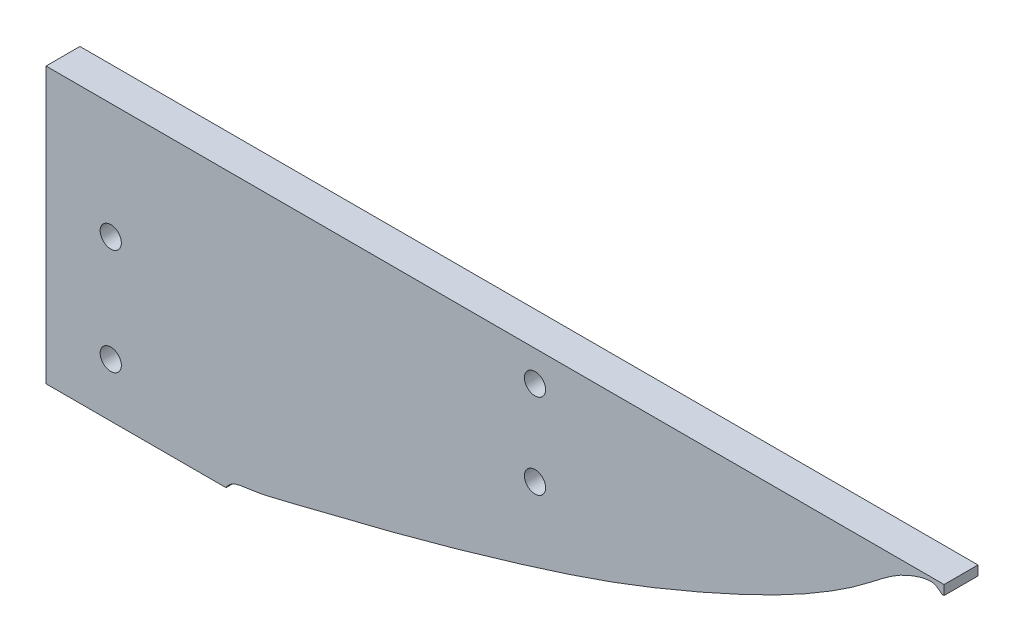
ISO-10303-21;
HEADER;
FILE_DESCRIPTION(('STEP AP214'),'2;1');
FILE_NAME('part.step','',(''),(''),'','','');
FILE_SCHEMA(('AUTOMOTIVE_DESIGN { 1 0 10303 214 1 1 1 1 }'));
ENDSEC;
DATA;
#1=APPLICATION_CONTEXT('core data for automotive mechanical design processes');
#2=APPLICATION_PROTOCOL_DEFINITION('international standard','automotive_design',2000,#1);
#3=PRODUCT_CONTEXT('',#1,'mechanical');
#4=PRODUCT('Part','Part','',(#3));
#5=PRODUCT_RELATED_PRODUCT_CATEGORY('part','',(#4));
#6=PRODUCT_DEFINITION_FORMATION('','',#4);
#7=PRODUCT_DEFINITION_CONTEXT('part definition',#1,'design');
#8=PRODUCT_DEFINITION('design','',#6,#7);
#9=PRODUCT_DEFINITION_SHAPE('','',#8);
#10=(LENGTH_UNIT() NAMED_UNIT(*) SI_UNIT(.MILLI.,.METRE.));
#11=(NAMED_UNIT(*) PLANE_ANGLE_UNIT() SI_UNIT($,.RADIAN.));
#12=(NAMED_UNIT(*) SI_UNIT($,.STERADIAN.) SOLID_ANGLE_UNIT());
#13=UNCERTAINTY_MEASURE_WITH_UNIT(LENGTH_MEASURE(1.E-05),#10,'distance_accuracy_value','');
#14=(GEOMETRIC_REPRESENTATION_CONTEXT(3) GLOBAL_UNCERTAINTY_ASSIGNED_CONTEXT((#13)) GLOBAL_UNIT_ASSIGNED_CONTEXT((#10,
#11,#12)) REPRESENTATION_CONTEXT('',''));
#15=CARTESIAN_POINT('',(0.,0.,0.));
#16=DIRECTION('',(0.,0.,1.));
#17=DIRECTION('',(1.,0.,0.));
#18=AXIS2_PLACEMENT_3D('',#15,#16,#17);
#19=CARTESIAN_POINT('',(-94.0449350170954,-62.656824564111,228.));
#20=DIRECTION('',(0.,0.,-1.));
#21=DIRECTION('',(-1.,0.,0.));
#22=AXIS2_PLACEMENT_3D('',#19,#20,#21);
#23=PLANE('',#22);
#24=CARTESIAN_POINT('',(-100.,-50.,228.));
#25=DIRECTION('',(0.,0.,-1.));
#26=DIRECTION('',(-1.,0.,0.));
#27=AXIS2_PLACEMENT_3D('',#24,#25,#26);
#28=CIRCLE('',#27,2.5);
#29=CARTESIAN_POINT('',(-102.5,-50.,228.));
#30=VERTEX_POINT('',#29);
#31=EDGE_CURVE('E207',#30,#30,#28,.F.);
#32=ORIENTED_EDGE('',*,*,#31,.F.);
#33=EDGE_LOOP('',(#32));
#34=FACE_BOUND('',#33,.T.);
#35=CARTESIAN_POINT('',(0.0705666698621599,-4.96037406111782,228.));
#36=DIRECTION('',(0.,0.,-1.));
#37=DIRECTION('',(-1.,0.,0.));
#38=AXIS2_PLACEMENT_3D('',#35,#36,#37);
#39=CIRCLE('',#38,2.5);
#40=CARTESIAN_POINT('',(-2.42943333013784,-4.96037406111782,228.));
#41=VERTEX_POINT('',#40);
#42=EDGE_CURVE('E203',#41,#41,#39,.F.);
#43=ORIENTED_EDGE('',*,*,#42,.F.);
#44=EDGE_LOOP('',(#43));
#45=FACE_BOUND('',#44,.T.);
#46=CARTESIAN_POINT('',(-72.8138292775494,-62.6476460664554,228.));
#47=CARTESIAN_POINT('',(-86.9678990777141,-62.6551055669489,228.));
#48=CARTESIAN_POINT('',(-101.121970515822,-62.659809078222,228.));
#49=CARTESIAN_POINT('',(-115.276042078606,-62.6622065109201,228.));
#50=B_SPLINE_CURVE_WITH_KNOTS('',3,(#46,#47,#48,#49),.UNSPECIFIED.,.F.,.F.,(4,4),(0.,1.),.UNSPECIFIED.);
#51=CARTESIAN_POINT('',(-115.276042078606,-62.6622065109201,228.));
#52=VERTEX_POINT('',#51);
#53=CARTESIAN_POINT('',(-72.8138292775494,-62.6476460664554,228.));
#54=VERTEX_POINT('',#53);
#55=EDGE_CURVE('E161',#52,#54,#50,.F.);
#56=ORIENTED_EDGE('',*,*,#55,.T.);
#57=CARTESIAN_POINT('',(95.9870795727235,0.,228.));
#58=CARTESIAN_POINT('',(95.9396036215973,0.112970505474959,228.));
#59=CARTESIAN_POINT('',(95.8579303670769,0.205342269269456,228.));
#60=CARTESIAN_POINT('',(95.6740200014432,0.364422958553267,228.));
#61=CARTESIAN_POINT('',(95.5751440351207,0.434492101100061,228.));
#62=CARTESIAN_POINT('',(95.2797180362278,0.646344348072362,228.));
#63=CARTESIAN_POINT('',(95.0871777384003,0.794286576688228,228.));
#64=CARTESIAN_POINT('',(94.7768780255614,0.984705681427013,228.));
#65=CARTESIAN_POINT('',(94.671513747439,1.04363294600287,228.));
#66=CARTESIAN_POINT('',(94.4535928153316,1.14455624627082,228.));
#67=CARTESIAN_POINT('',(94.3406654183511,1.18567953356444,228.));
#68=CARTESIAN_POINT('',(94.1073823704226,1.25043960987482,228.));
#69=CARTESIAN_POINT('',(93.986924979145,1.27409407200593,228.));
#70=CARTESIAN_POINT('',(93.7475325240829,1.306138985399,228.));
#71=CARTESIAN_POINT('',(93.6275436018803,1.31488585002167,228.));
#72=CARTESIAN_POINT('',(93.2669492660129,1.32552678194474,228.));
#73=CARTESIAN_POINT('',(93.0248882888412,1.31231421308436,228.));
#74=CARTESIAN_POINT('',(92.5438118686369,1.26378219102834,228.));
#75=CARTESIAN_POINT('',(92.3059003093066,1.22952957432613,228.));
#76=CARTESIAN_POINT('',(91.5987894124152,1.10158790815188,228.));
#77=CARTESIAN_POINT('',(91.1363844806001,0.982066322545524,228.));
#78=CARTESIAN_POINT('',(90.2199640456016,0.711126289948076,228.));
#79=CARTESIAN_POINT('',(89.7661271218269,0.559028878644449,228.));
#80=CARTESIAN_POINT('',(88.8663552607127,0.224790464625407,228.));
#81=CARTESIAN_POINT('',(88.4213569057542,0.043423723610443,228.));
#82=CARTESIAN_POINT('',(87.1116733654125,-0.534539987551747,228.));
#83=CARTESIAN_POINT('',(86.268105842587,-0.968133371146181,228.));
#84=CARTESIAN_POINT('',(83.8232832711083,-2.4092171403159,228.));
#85=CARTESIAN_POINT('',(82.3036656324402,-3.55007995738963,228.));
#86=CARTESIAN_POINT('',(80.044364990563,-5.2942540726603,228.));
#87=CARTESIAN_POINT('',(79.2940216254808,-5.88000311100967,228.));
#88=CARTESIAN_POINT('',(77.781688623662,-7.03347512957981,228.));
#89=CARTESIAN_POINT('',(77.0210553679462,-7.60333835990149,228.));
#90=CARTESIAN_POINT('',(74.7141962839172,-9.2745243606159,228.));
#91=CARTESIAN_POINT('',(73.1418739127763,-10.3356936463561,228.));
#92=CARTESIAN_POINT('',(69.9508267883373,-12.3866351231282,228.));
#93=CARTESIAN_POINT('',(68.3326277693247,-13.3772162360054,228.));
#94=CARTESIAN_POINT('',(65.0624023154828,-15.3063298578192,228.));
#95=CARTESIAN_POINT('',(63.4099573722207,-16.2442184281299,228.));
#96=CARTESIAN_POINT('',(60.0697582878732,-18.0656670187105,228.));
#97=CARTESIAN_POINT('',(58.3848769009774,-18.9487092848543,228.));
#98=CARTESIAN_POINT('',(53.2980752985602,-21.532497468782,228.));
#99=CARTESIAN_POINT('',(49.8636950163529,-23.1719321313768,228.));
#100=CARTESIAN_POINT('',(42.9518982520274,-26.3473643864309,228.));
#101=CARTESIAN_POINT('',(39.4722656668555,-27.8813904963574,228.));
#102=CARTESIAN_POINT('',(32.472735085506,-30.8583568421761,228.));
#103=CARTESIAN_POINT('',(28.9527451952238,-32.3028281861177,228.));
#104=CARTESIAN_POINT('',(21.8687438195763,-35.0762716955292,228.));
#105=CARTESIAN_POINT('',(18.3018847036567,-36.4016530085633,228.));
#106=CARTESIAN_POINT('',(11.1253545823098,-38.9198955737178,228.));
#107=CARTESIAN_POINT('',(7.51554380203982,-40.1147939434406,228.));
#108=CARTESIAN_POINT('',(0.269363888531351,-42.4254262446499,228.));
#109=CARTESIAN_POINT('',(-3.36664527588712,-43.5429762073017,228.));
#110=CARTESIAN_POINT('',(-10.6519424974999,-45.7297521851299,228.));
#111=CARTESIAN_POINT('',(-14.3012881897841,-46.8002541561035,228.));
#112=CARTESIAN_POINT('',(-21.6175611917676,-48.8811762231445,228.));
#113=CARTESIAN_POINT('',(-25.2849219976847,-49.8906808713797,228.));
#114=CARTESIAN_POINT('',(-36.3093462417465,-52.8332367290553,228.));
#115=CARTESIAN_POINT('',(-43.6895943349814,-54.6791792913748,228.));
#116=CARTESIAN_POINT('',(-52.9161366864018,-56.9790789525766,228.));
#117=CARTESIAN_POINT('',(-54.7619352745016,-57.4370678581288,228.));
#118=CARTESIAN_POINT('',(-57.532388194458,-58.1169216508708,228.));
#119=CARTESIAN_POINT('',(-58.4561678992463,-58.3423395732279,228.));
#120=CARTESIAN_POINT('',(-60.3042880671966,-58.7908974250758,228.));
#121=CARTESIAN_POINT('',(-61.2280994114436,-59.0164669045202,228.));
#122=CARTESIAN_POINT('',(-63.079297355708,-59.4510652340884,228.));
#123=CARTESIAN_POINT('',(-64.0073538284621,-59.6570622610554,228.));
#124=CARTESIAN_POINT('',(-65.4087449470293,-59.9232572743801,228.));
#125=CARTESIAN_POINT('',(-65.8773594543555,-60.0051494778518,228.));
#126=CARTESIAN_POINT('',(-66.8178709727226,-60.1539204407423,228.));
#127=CARTESIAN_POINT('',(-67.2902735104697,-60.2184885367757,228.));
#128=CARTESIAN_POINT('',(-68.2366723176885,-60.3403364696576,228.));
#129=CARTESIAN_POINT('',(-68.7099355051901,-60.4009687473963,228.));
#130=CARTESIAN_POINT('',(-69.4130861004259,-60.5227588514234,228.));
#131=CARTESIAN_POINT('',(-69.6463857518927,-60.5683122216158,228.));
#132=CARTESIAN_POINT('',(-70.1095475394248,-60.6751389874045,228.));
#133=CARTESIAN_POINT('',(-70.3393931671471,-60.7364878769376,228.));
#134=CARTESIAN_POINT('',(-70.792622261134,-60.8887376231701,228.));
#135=CARTESIAN_POINT('',(-71.0160661430338,-60.979362194469,228.));
#136=CARTESIAN_POINT('',(-71.3431016887533,-61.1524794413494,228.));
#137=CARTESIAN_POINT('',(-71.4518100613056,-61.2171950220773,228.));
#138=CARTESIAN_POINT('',(-71.6594473144561,-61.3586836626376,228.));
#139=CARTESIAN_POINT('',(-71.7583529462895,-61.4351048145036,228.));
#140=CARTESIAN_POINT('',(-72.0455840423709,-61.6753288529205,228.));
#141=CARTESIAN_POINT('',(-72.2212934636005,-61.8537092334965,228.));
#142=CARTESIAN_POINT('',(-72.4812153821046,-62.1254882826553,228.));
#143=CARTESIAN_POINT('',(-72.5668592290392,-62.2169509466378,228.));
#144=CARTESIAN_POINT('',(-72.6818181157841,-62.3657950955771,228.));
#145=CARTESIAN_POINT('',(-72.7175451499989,-62.4177630143983,228.));
#146=CARTESIAN_POINT('',(-72.7764684265662,-62.5276203665999,228.));
#147=CARTESIAN_POINT('',(-72.8001153141704,-62.5868842513674,228.));
#148=CARTESIAN_POINT('',(-72.8138292775494,-62.6476460664554,228.));
#149=B_SPLINE_CURVE_WITH_KNOTS('',3,(#57,#58,#59,#60,#61,#62,#63,#64,#65,#66,#67,#68,#69,#70,
#71,#72,#73,#74,#75,#76,#77,#78,#79,#80,#81,#82,#83,#84,#85,#86,#87,#88,#89,#90,#91,#92,#93,#94,
#95,#96,#97,#98,#99,#100,#101,#102,#103,#104,#105,#106,#107,#108,#109,#110,#111,#112,#113,#114,
#115,#116,#117,#118,#119,#120,#121,#122,#123,#124,#125,#126,#127,#128,#129,#130,#131,#132,#133,
#134,#135,#136,#137,#138,#139,#140,#141,#142,#143,#144,#145,#146,#147,#148),.UNSPECIFIED.,.F.,
.F.,(4,2,2,2,2,2,2,2,2,2,2,2,2,2,2,2,2,2,2,2,2,2,2,2,2,2,2,2,2,2,2,2,2,2,2,2,2,2,2,2,2,2,2,2,2,
4),(0.,0.00195312500000011,0.00390625000000011,0.00781250000000044,0.00976562500000067,
0.0117187500000008,0.013671875000001,0.0156250000000011,0.0195312500000012,0.0234375000000013,
0.0312500000000013,0.0390625000000013,0.0468750000000012,0.0625000000000012,0.0937500000000011,
0.109375000000001,0.125000000000001,0.156250000000001,0.187500000000001,0.218750000000001,
0.250000000000001,0.312500000000001,0.375000000000001,0.437500000000001,0.500000000000001,
0.562500000000001,0.625000000000001,0.687500000000001,0.750000000000001,0.875,0.906250000000001,
0.921875000000001,0.937500000000001,0.953125,0.9609375,0.96875,0.9765625,0.98046875,0.984375,
0.98828125,0.990234375,0.9921875,0.99609375,0.998046875,0.9990234375,1.),.UNSPECIFIED.);
#150=CARTESIAN_POINT('',(95.9870795727235,0.,228.));
#151=VERTEX_POINT('',#150);
#152=EDGE_CURVE('E88',#54,#151,#149,.F.);
#153=ORIENTED_EDGE('',*,*,#152,.T.);
#154=DIRECTION('',(1.,1.0259453337292E-13,0.));
#155=VECTOR('',#154,1.);
#156=CARTESIAN_POINT('',(95.9870795727235,0.,228.));
#157=LINE('',#156,#155);
#158=CARTESIAN_POINT('',(96.5604176839786,0.,228.));
#159=VERTEX_POINT('',#158);
#160=EDGE_CURVE('E102',#151,#159,#157,.T.);
#161=ORIENTED_EDGE('',*,*,#160,.T.);
#162=DIRECTION('',(0.,1.,0.));
#163=VECTOR('',#162,1.);
#164=CARTESIAN_POINT('',(96.5604176839786,2.25600000000004,228.));
#165=LINE('',#164,#163);
#166=CARTESIAN_POINT('',(96.5604176839786,2.25600000000004,228.));
#167=VERTEX_POINT('',#166);
#168=EDGE_CURVE('E96',#159,#167,#165,.T.);
#169=ORIENTED_EDGE('',*,*,#168,.T.);
#170=DIRECTION('',(-1.,0.,0.));
#171=VECTOR('',#170,1.);
#172=CARTESIAN_POINT('',(96.5604176839786,2.25600000000004,228.));
#173=LINE('',#172,#171);
#174=CARTESIAN_POINT('',(-115.276042078606,2.25600000000002,228.));
#175=VERTEX_POINT('',#174);
#176=EDGE_CURVE('E100',#167,#175,#173,.T.);
#177=ORIENTED_EDGE('',*,*,#176,.T.);
#178=DIRECTION('',(0.,-1.,0.));
#179=VECTOR('',#178,1.);
#180=CARTESIAN_POINT('',(-115.276042078606,-62.6622065109201,228.));
#181=LINE('',#180,#179);
#182=EDGE_CURVE('E51',#175,#52,#181,.T.);
#183=ORIENTED_EDGE('',*,*,#182,.T.);
#184=EDGE_LOOP('',(#56,#153,#161,#169,#177,#183));
#185=FACE_BOUND('',#184,.T.);
#186=CARTESIAN_POINT('',(0.0705666698621599,-25.,228.));
#187=DIRECTION('',(0.,0.,-1.));
#188=DIRECTION('',(-1.,0.,0.));
#189=AXIS2_PLACEMENT_3D('',#186,#187,#188);
#190=CIRCLE('',#189,2.5);
#191=CARTESIAN_POINT('',(-2.42943333013784,-25.,228.));
#192=VERTEX_POINT('',#191);
#193=EDGE_CURVE('E204',#192,#192,#190,.F.);
#194=ORIENTED_EDGE('',*,*,#193,.F.);
#195=EDGE_LOOP('',(#194));
#196=FACE_BOUND('',#195,.T.);
#197=CARTESIAN_POINT('',(-100.,-25.,228.));
#198=DIRECTION('',(0.,0.,-1.));
#199=DIRECTION('',(-1.,0.,0.));
#200=AXIS2_PLACEMENT_3D('',#197,#198,#199);
#201=CIRCLE('',#200,2.5);
#202=CARTESIAN_POINT('',(-102.5,-25.,228.));
#203=VERTEX_POINT('',#202);
#204=EDGE_CURVE('E210',#203,#203,#201,.F.);
#205=ORIENTED_EDGE('',*,*,#204,.F.);
#206=EDGE_LOOP('',(#205));
#207=FACE_BOUND('',#206,.T.);
#208=ADVANCED_FACE('F30',(#34,#45,#185,#196,#207),#23,.F.);
#209=CARTESIAN_POINT('',(-94.0449350170954,-62.656824564111,220.));
#210=DIRECTION('',(0.,0.,-1.));
#211=DIRECTION('',(-1.,0.,0.));
#212=AXIS2_PLACEMENT_3D('',#209,#210,#211);
#213=PLANE('',#212);
#214=CARTESIAN_POINT('',(-100.,-50.,220.));
#215=DIRECTION('',(0.,0.,-1.));
#216=DIRECTION('',(-1.,0.,0.));
#217=AXIS2_PLACEMENT_3D('',#214,#215,#216);
#218=CIRCLE('',#217,2.5);
#219=CARTESIAN_POINT('',(-102.5,-50.,220.));
#220=VERTEX_POINT('',#219);
#221=EDGE_CURVE('E208',#220,#220,#218,.F.);
#222=ORIENTED_EDGE('',*,*,#221,.T.);
#223=EDGE_LOOP('',(#222));
#224=FACE_BOUND('',#223,.T.);
#225=CARTESIAN_POINT('',(0.0705666698621599,-4.96037406111782,220.));
#226=DIRECTION('',(0.,0.,-1.));
#227=DIRECTION('',(-1.,0.,0.));
#228=AXIS2_PLACEMENT_3D('',#225,#226,#227);
#229=CIRCLE('',#228,2.5);
#230=CARTESIAN_POINT('',(-2.42943333013784,-4.96037406111782,220.));
#231=VERTEX_POINT('',#230);
#232=EDGE_CURVE('E200',#231,#231,#229,.F.);
#233=ORIENTED_EDGE('',*,*,#232,.T.);
#234=EDGE_LOOP('',(#233));
#235=FACE_BOUND('',#234,.T.);
#236=CARTESIAN_POINT('',(-115.276042078606,-62.6622065109201,220.));
#237=CARTESIAN_POINT('',(-101.121970515822,-62.659809078222,220.));
#238=CARTESIAN_POINT('',(-86.9678990777141,-62.6551055669489,220.));
#239=CARTESIAN_POINT('',(-72.8138292775494,-62.6476460664554,220.));
#240=B_SPLINE_CURVE_WITH_KNOTS('',3,(#236,#237,#238,#239),.UNSPECIFIED.,.F.,.F.,(4,4),(0.,1.),.UNSPECIFIED.);
#241=CARTESIAN_POINT('',(-115.276042078606,-62.6622065109201,220.));
#242=VERTEX_POINT('',#241);
#243=CARTESIAN_POINT('',(-72.8138292775494,-62.6476460664554,220.));
#244=VERTEX_POINT('',#243);
#245=EDGE_CURVE('E178',#242,#244,#240,.T.);
#246=ORIENTED_EDGE('',*,*,#245,.F.);
#247=DIRECTION('',(0.,-1.,0.));
#248=VECTOR('',#247,1.);
#249=CARTESIAN_POINT('',(-115.276042078606,-62.6622065109201,220.));
#250=LINE('',#249,#248);
#251=CARTESIAN_POINT('',(-115.276042078606,2.25600000000002,220.));
#252=VERTEX_POINT('',#251);
#253=EDGE_CURVE('E80',#252,#242,#250,.T.);
#254=ORIENTED_EDGE('',*,*,#253,.F.);
#255=DIRECTION('',(-1.,0.,0.));
#256=VECTOR('',#255,1.);
#257=CARTESIAN_POINT('',(96.5604176839786,2.25600000000004,220.));
#258=LINE('',#257,#256);
#259=CARTESIAN_POINT('',(96.5604176839786,2.25600000000004,220.));
#260=VERTEX_POINT('',#259);
#261=EDGE_CURVE('E74',#260,#252,#258,.T.);
#262=ORIENTED_EDGE('',*,*,#261,.F.);
#263=DIRECTION('',(0.,1.,0.));
#264=VECTOR('',#263,1.);
#265=CARTESIAN_POINT('',(96.5604176839786,2.25600000000004,220.));
#266=LINE('',#265,#264);
#267=CARTESIAN_POINT('',(96.5604176839786,0.,220.));
#268=VERTEX_POINT('',#267);
#269=EDGE_CURVE('E110',#268,#260,#266,.T.);
#270=ORIENTED_EDGE('',*,*,#269,.F.);
#271=DIRECTION('',(1.,1.0259453337292E-13,0.));
#272=VECTOR('',#271,1.);
#273=CARTESIAN_POINT('',(95.9870795727235,0.,220.));
#274=LINE('',#273,#272);
#275=CARTESIAN_POINT('',(95.9870795727235,0.,220.));
#276=VERTEX_POINT('',#275);
#277=EDGE_CURVE('E121',#276,#268,#274,.T.);
#278=ORIENTED_EDGE('',*,*,#277,.F.);
#279=CARTESIAN_POINT('',(-72.8138292775494,-62.6476460664554,220.));
#280=CARTESIAN_POINT('',(-72.8001153141704,-62.5868842513674,220.));
#281=CARTESIAN_POINT('',(-72.7764684265662,-62.5276203665999,220.));
#282=CARTESIAN_POINT('',(-72.7175451499989,-62.4177630143983,220.));
#283=CARTESIAN_POINT('',(-72.6818181157841,-62.3657950955771,220.));
#284=CARTESIAN_POINT('',(-72.5668592290392,-62.2169509466378,220.));
#285=CARTESIAN_POINT('',(-72.4812153821046,-62.1254882826553,220.));
#286=CARTESIAN_POINT('',(-72.2212934636005,-61.8537092334965,220.));
#287=CARTESIAN_POINT('',(-72.0455840423709,-61.6753288529205,220.));
#288=CARTESIAN_POINT('',(-71.7583529462895,-61.4351048145036,220.));
#289=CARTESIAN_POINT('',(-71.6594473144561,-61.3586836626376,220.));
#290=CARTESIAN_POINT('',(-71.4518100613056,-61.2171950220773,220.));
#291=CARTESIAN_POINT('',(-71.3431016887533,-61.1524794413494,220.));
#292=CARTESIAN_POINT('',(-71.0160661430338,-60.979362194469,220.));
#293=CARTESIAN_POINT('',(-70.792622261134,-60.8887376231701,220.));
#294=CARTESIAN_POINT('',(-70.3393931671471,-60.7364878769376,220.));
#295=CARTESIAN_POINT('',(-70.1095475394248,-60.6751389874045,220.));
#296=CARTESIAN_POINT('',(-69.6463857518927,-60.5683122216158,220.));
#297=CARTESIAN_POINT('',(-69.4130861004259,-60.5227588514234,220.));
#298=CARTESIAN_POINT('',(-68.7099355051901,-60.4009687473963,220.));
#299=CARTESIAN_POINT('',(-68.2366723176885,-60.3403364696576,220.));
#300=CARTESIAN_POINT('',(-67.2902735104697,-60.2184885367757,220.));
#301=CARTESIAN_POINT('',(-66.8178709727226,-60.1539204407423,220.));
#302=CARTESIAN_POINT('',(-65.8773594543555,-60.0051494778518,220.));
#303=CARTESIAN_POINT('',(-65.4087449470293,-59.9232572743801,220.));
#304=CARTESIAN_POINT('',(-64.0073538284621,-59.6570622610554,220.));
#305=CARTESIAN_POINT('',(-63.079297355708,-59.4510652340884,220.));
#306=CARTESIAN_POINT('',(-61.2280994114436,-59.0164669045202,220.));
#307=CARTESIAN_POINT('',(-60.3042880671966,-58.7908974250758,220.));
#308=CARTESIAN_POINT('',(-58.4561678992463,-58.3423395732279,220.));
#309=CARTESIAN_POINT('',(-57.532388194458,-58.1169216508708,220.));
#310=CARTESIAN_POINT('',(-54.7619352745016,-57.4370678581288,220.));
#311=CARTESIAN_POINT('',(-52.9161366864018,-56.9790789525766,220.));
#312=CARTESIAN_POINT('',(-43.6895943349814,-54.6791792913748,220.));
#313=CARTESIAN_POINT('',(-36.3093462417465,-52.8332367290553,220.));
#314=CARTESIAN_POINT('',(-25.2849219976847,-49.8906808713797,220.));
#315=CARTESIAN_POINT('',(-21.6175611917676,-48.8811762231445,220.));
#316=CARTESIAN_POINT('',(-14.3012881897841,-46.8002541561035,220.));
#317=CARTESIAN_POINT('',(-10.6519424974999,-45.7297521851299,220.));
#318=CARTESIAN_POINT('',(-3.36664527588712,-43.5429762073017,220.));
#319=CARTESIAN_POINT('',(0.269363888531351,-42.4254262446499,220.));
#320=CARTESIAN_POINT('',(7.51554380203982,-40.1147939434406,220.));
#321=CARTESIAN_POINT('',(11.1253545823098,-38.9198955737178,220.));
#322=CARTESIAN_POINT('',(18.3018847036567,-36.4016530085633,220.));
#323=CARTESIAN_POINT('',(21.8687438195763,-35.0762716955292,220.));
#324=CARTESIAN_POINT('',(28.9527451952238,-32.3028281861177,220.));
#325=CARTESIAN_POINT('',(32.472735085506,-30.8583568421761,220.));
#326=CARTESIAN_POINT('',(39.4722656668555,-27.8813904963574,220.));
#327=CARTESIAN_POINT('',(42.9518982520274,-26.3473643864309,220.));
#328=CARTESIAN_POINT('',(49.8636950163529,-23.1719321313768,220.));
#329=CARTESIAN_POINT('',(53.2980752985602,-21.532497468782,220.));
#330=CARTESIAN_POINT('',(58.3848769009774,-18.9487092848543,220.));
#331=CARTESIAN_POINT('',(60.0697582878732,-18.0656670187105,220.));
#332=CARTESIAN_POINT('',(63.4099573722207,-16.2442184281299,220.));
#333=CARTESIAN_POINT('',(65.0624023154828,-15.3063298578192,220.));
#334=CARTESIAN_POINT('',(68.3326277693247,-13.3772162360054,220.));
#335=CARTESIAN_POINT('',(69.9508267883373,-12.3866351231282,220.));
#336=CARTESIAN_POINT('',(73.1418739127763,-10.3356936463561,220.));
#337=CARTESIAN_POINT('',(74.7141962839172,-9.2745243606159,220.));
#338=CARTESIAN_POINT('',(77.0210553679462,-7.60333835990149,220.));
#339=CARTESIAN_POINT('',(77.781688623662,-7.03347512957981,220.));
#340=CARTESIAN_POINT('',(79.2940216254808,-5.88000311100967,220.));
#341=CARTESIAN_POINT('',(80.044364990563,-5.2942540726603,220.));
#342=CARTESIAN_POINT('',(82.3036656324402,-3.55007995738963,220.));
#343=CARTESIAN_POINT('',(83.8232832711083,-2.4092171403159,220.));
#344=CARTESIAN_POINT('',(86.268105842587,-0.968133371146181,220.));
#345=CARTESIAN_POINT('',(87.1116733654125,-0.534539987551747,220.));
#346=CARTESIAN_POINT('',(88.4213569057542,0.043423723610443,220.));
#347=CARTESIAN_POINT('',(88.8663552607127,0.224790464625407,220.));
#348=CARTESIAN_POINT('',(89.7661271218269,0.559028878644449,220.));
#349=CARTESIAN_POINT('',(90.2199640456016,0.711126289948076,220.));
#350=CARTESIAN_POINT('',(91.1363844806001,0.982066322545524,220.));
#351=CARTESIAN_POINT('',(91.5987894124152,1.10158790815188,220.));
#352=CARTESIAN_POINT('',(92.3059003093066,1.22952957432613,220.));
#353=CARTESIAN_POINT('',(92.5438118686369,1.26378219102834,220.));
#354=CARTESIAN_POINT('',(93.0248882888412,1.31231421308436,220.));
#355=CARTESIAN_POINT('',(93.2669492660129,1.32552678194474,220.));
#356=CARTESIAN_POINT('',(93.6275436018803,1.31488585002167,220.));
#357=CARTESIAN_POINT('',(93.7475325240829,1.306138985399,220.));
#358=CARTESIAN_POINT('',(93.986924979145,1.27409407200593,220.));
#359=CARTESIAN_POINT('',(94.1073823704226,1.25043960987482,220.));
#360=CARTESIAN_POINT('',(94.3406654183511,1.18567953356444,220.));
#361=CARTESIAN_POINT('',(94.4535928153316,1.14455624627082,220.));
#362=CARTESIAN_POINT('',(94.671513747439,1.04363294600287,220.));
#363=CARTESIAN_POINT('',(94.7768780255614,0.984705681427013,220.));
#364=CARTESIAN_POINT('',(95.0871777384003,0.794286576688228,220.));
#365=CARTESIAN_POINT('',(95.2797180362278,0.646344348072362,220.));
#366=CARTESIAN_POINT('',(95.5751440351207,0.434492101100061,220.));
#367=CARTESIAN_POINT('',(95.6740200014432,0.364422958553267,220.));
#368=CARTESIAN_POINT('',(95.8579303670769,0.205342269269456,220.));
#369=CARTESIAN_POINT('',(95.9396036215973,0.112970505474959,220.));
#370=CARTESIAN_POINT('',(95.9870795727235,0.,220.));
#371=B_SPLINE_CURVE_WITH_KNOTS('',3,(#279,#280,#281,#282,#283,#284,#285,#286,#287,#288,#289,
#290,#291,#292,#293,#294,#295,#296,#297,#298,#299,#300,#301,#302,#303,#304,#305,#306,#307,#308,
#309,#310,#311,#312,#313,#314,#315,#316,#317,#318,#319,#320,#321,#322,#323,#324,#325,#326,#327,
#328,#329,#330,#331,#332,#333,#334,#335,#336,#337,#338,#339,#340,#341,#342,#343,#344,#345,#346,
#347,#348,#349,#350,#351,#352,#353,#354,#355,#356,#357,#358,#359,#360,#361,#362,#363,#364,#365,
#366,#367,#368,#369,#370),.UNSPECIFIED.,.F.,.F.,(4,2,2,2,2,2,2,2,2,2,2,2,2,2,2,2,2,2,2,2,2,2,2,
2,2,2,2,2,2,2,2,2,2,2,2,2,2,2,2,2,2,2,2,2,2,4),(0.,0.000976562499999889,0.00195312499999989,
0.00390624999999989,0.0078125,0.00976562499999989,0.0117187499999999,0.0156249999999998,
0.0195312499999998,0.0234374999999997,0.0312499999999996,0.0390624999999996,0.0468749999999996,
0.0624999999999994,0.0781249999999994,0.0937499999999994,0.125,0.249999999999999,
0.312499999999999,0.374999999999999,0.437499999999999,0.499999999999999,0.562499999999999,
0.624999999999999,0.687499999999999,0.749999999999999,0.781249999999999,0.812499999999999,
0.843749999999999,0.874999999999999,0.890624999999999,0.906249999999999,0.937499999999999,
0.953124999999999,0.960937499999999,0.968749999999999,0.976562499999999,0.980468749999999,
0.984374999999999,0.986328124999999,0.988281249999999,0.990234374999999,0.9921875,0.99609375,
0.998046875,1.),.UNSPECIFIED.);
#372=EDGE_CURVE('E258',#244,#276,#371,.T.);
#373=ORIENTED_EDGE('',*,*,#372,.F.);
#374=EDGE_LOOP('',(#246,#254,#262,#270,#278,#373));
#375=FACE_BOUND('',#374,.T.);
#376=CARTESIAN_POINT('',(0.0705666698621599,-25.,220.));
#377=DIRECTION('',(0.,0.,-1.));
#378=DIRECTION('',(-1.,0.,0.));
#379=AXIS2_PLACEMENT_3D('',#376,#377,#378);
#380=CIRCLE('',#379,2.5);
#381=CARTESIAN_POINT('',(-2.42943333013784,-25.,220.));
#382=VERTEX_POINT('',#381);
#383=EDGE_CURVE('E205',#382,#382,#380,.F.);
#384=ORIENTED_EDGE('',*,*,#383,.T.);
#385=EDGE_LOOP('',(#384));
#386=FACE_BOUND('',#385,.T.);
#387=CARTESIAN_POINT('',(-100.,-25.,220.));
#388=DIRECTION('',(0.,0.,-1.));
#389=DIRECTION('',(-1.,0.,0.));
#390=AXIS2_PLACEMENT_3D('',#387,#388,#389);
#391=CIRCLE('',#390,2.5);
#392=CARTESIAN_POINT('',(-102.5,-25.,220.));
#393=VERTEX_POINT('',#392);
#394=EDGE_CURVE('E36',#393,#393,#391,.F.);
#395=ORIENTED_EDGE('',*,*,#394,.T.);
#396=EDGE_LOOP('',(#395));
#397=FACE_BOUND('',#396,.T.);
#398=ADVANCED_FACE('F139',(#224,#235,#375,#386,#397),#213,.T.);
#399=CARTESIAN_POINT('',(-115.276042078606,-62.6622065109201,228.));
#400=CARTESIAN_POINT('',(-101.121970515822,-62.659809078222,228.));
#401=CARTESIAN_POINT('',(-86.9678990777141,-62.6551055669489,228.));
#402=CARTESIAN_POINT('',(-72.8138292775494,-62.6476460664554,228.));
#403=B_SPLINE_CURVE_WITH_KNOTS('',3,(#399,#400,#401,#402),.UNSPECIFIED.,.F.,.F.,(4,4),(0.,1.),.UNSPECIFIED.);
#404=DIRECTION('',(0.,0.,-1.));
#405=VECTOR('',#404,1.);
#406=SURFACE_OF_LINEAR_EXTRUSION('',#403,#405);
#407=ORIENTED_EDGE('',*,*,#245,.T.);
#408=DIRECTION('',(0.,0.,-1.));
#409=VECTOR('',#408,1.);
#410=CARTESIAN_POINT('',(-72.8138292775494,-62.6476460664554,228.));
#411=LINE('',#410,#409);
#412=EDGE_CURVE('E11',#54,#244,#411,.T.);
#413=ORIENTED_EDGE('',*,*,#412,.F.);
#414=ORIENTED_EDGE('',*,*,#55,.F.);
#415=DIRECTION('',(0.,0.,-1.));
#416=VECTOR('',#415,1.);
#417=CARTESIAN_POINT('',(-115.276042078606,-62.6622065109201,228.));
#418=LINE('',#417,#416);
#419=EDGE_CURVE('E116',#52,#242,#418,.T.);
#420=ORIENTED_EDGE('',*,*,#419,.T.);
#421=EDGE_LOOP('',(#407,#413,#414,#420));
#422=FACE_BOUND('',#421,.T.);
#423=ADVANCED_FACE('F32',(#422),#406,.F.);
#424=CARTESIAN_POINT('',(-72.8138292775494,-62.6476460664554,228.));
#425=CARTESIAN_POINT('',(-72.8001153141704,-62.5868842513674,228.));
#426=CARTESIAN_POINT('',(-72.7764684265662,-62.5276203665999,228.));
#427=CARTESIAN_POINT('',(-72.7175451499989,-62.4177630143983,228.));
#428=CARTESIAN_POINT('',(-72.6818181157841,-62.3657950955771,228.));
#429=CARTESIAN_POINT('',(-72.5668592290392,-62.2169509466378,228.));
#430=CARTESIAN_POINT('',(-72.4812153821046,-62.1254882826553,228.));
#431=CARTESIAN_POINT('',(-72.2212934636005,-61.8537092334965,228.));
#432=CARTESIAN_POINT('',(-72.0455840423709,-61.6753288529205,228.));
#433=CARTESIAN_POINT('',(-71.7583529462895,-61.4351048145036,228.));
#434=CARTESIAN_POINT('',(-71.6594473144561,-61.3586836626376,228.));
#435=CARTESIAN_POINT('',(-71.4518100613056,-61.2171950220773,228.));
#436=CARTESIAN_POINT('',(-71.3431016887533,-61.1524794413494,228.));
#437=CARTESIAN_POINT('',(-71.0160661430338,-60.979362194469,228.));
#438=CARTESIAN_POINT('',(-70.792622261134,-60.8887376231701,228.));
#439=CARTESIAN_POINT('',(-70.3393931671471,-60.7364878769376,228.));
#440=CARTESIAN_POINT('',(-70.1095475394248,-60.6751389874045,228.));
#441=CARTESIAN_POINT('',(-69.6463857518927,-60.5683122216158,228.));
#442=CARTESIAN_POINT('',(-69.4130861004259,-60.5227588514234,228.));
#443=CARTESIAN_POINT('',(-68.7099355051901,-60.4009687473963,228.));
#444=CARTESIAN_POINT('',(-68.2366723176885,-60.3403364696576,228.));
#445=CARTESIAN_POINT('',(-67.2902735104697,-60.2184885367757,228.));
#446=CARTESIAN_POINT('',(-66.8178709727226,-60.1539204407423,228.));
#447=CARTESIAN_POINT('',(-65.8773594543555,-60.0051494778518,228.));
#448=CARTESIAN_POINT('',(-65.4087449470293,-59.9232572743801,228.));
#449=CARTESIAN_POINT('',(-64.0073538284621,-59.6570622610554,228.));
#450=CARTESIAN_POINT('',(-63.079297355708,-59.4510652340884,228.));
#451=CARTESIAN_POINT('',(-61.2280994114436,-59.0164669045202,228.));
#452=CARTESIAN_POINT('',(-60.3042880671966,-58.7908974250758,228.));
#453=CARTESIAN_POINT('',(-58.4561678992463,-58.3423395732279,228.));
#454=CARTESIAN_POINT('',(-57.532388194458,-58.1169216508708,228.));
#455=CARTESIAN_POINT('',(-54.7619352745016,-57.4370678581288,228.));
#456=CARTESIAN_POINT('',(-52.9161366864018,-56.9790789525766,228.));
#457=CARTESIAN_POINT('',(-43.6895943349814,-54.6791792913748,228.));
#458=CARTESIAN_POINT('',(-36.3093462417465,-52.8332367290553,228.));
#459=CARTESIAN_POINT('',(-25.2849219976847,-49.8906808713797,228.));
#460=CARTESIAN_POINT('',(-21.6175611917676,-48.8811762231445,228.));
#461=CARTESIAN_POINT('',(-14.3012881897841,-46.8002541561035,228.));
#462=CARTESIAN_POINT('',(-10.6519424974999,-45.7297521851299,228.));
#463=CARTESIAN_POINT('',(-3.36664527588712,-43.5429762073017,228.));
#464=CARTESIAN_POINT('',(0.269363888531351,-42.4254262446499,228.));
#465=CARTESIAN_POINT('',(7.51554380203982,-40.1147939434406,228.));
#466=CARTESIAN_POINT('',(11.1253545823098,-38.9198955737178,228.));
#467=CARTESIAN_POINT('',(18.3018847036567,-36.4016530085633,228.));
#468=CARTESIAN_POINT('',(21.8687438195763,-35.0762716955292,228.));
#469=CARTESIAN_POINT('',(28.9527451952238,-32.3028281861177,228.));
#470=CARTESIAN_POINT('',(32.472735085506,-30.8583568421761,228.));
#471=CARTESIAN_POINT('',(39.4722656668555,-27.8813904963574,228.));
#472=CARTESIAN_POINT('',(42.9518982520274,-26.3473643864309,228.));
#473=CARTESIAN_POINT('',(49.8636950163529,-23.1719321313768,228.));
#474=CARTESIAN_POINT('',(53.2980752985602,-21.532497468782,228.));
#475=CARTESIAN_POINT('',(58.3848769009774,-18.9487092848543,228.));
#476=CARTESIAN_POINT('',(60.0697582878732,-18.0656670187105,228.));
#477=CARTESIAN_POINT('',(63.4099573722207,-16.2442184281299,228.));
#478=CARTESIAN_POINT('',(65.0624023154828,-15.3063298578192,228.));
#479=CARTESIAN_POINT('',(68.3326277693247,-13.3772162360054,228.));
#480=CARTESIAN_POINT('',(69.9508267883373,-12.3866351231282,228.));
#481=CARTESIAN_POINT('',(73.1418739127763,-10.3356936463561,228.));
#482=CARTESIAN_POINT('',(74.7141962839172,-9.2745243606159,228.));
#483=CARTESIAN_POINT('',(77.0210553679462,-7.60333835990149,228.));
#484=CARTESIAN_POINT('',(77.781688623662,-7.03347512957981,228.));
#485=CARTESIAN_POINT('',(79.2940216254808,-5.88000311100967,228.));
#486=CARTESIAN_POINT('',(80.044364990563,-5.2942540726603,228.));
#487=CARTESIAN_POINT('',(82.3036656324402,-3.55007995738963,228.));
#488=CARTESIAN_POINT('',(83.8232832711083,-2.4092171403159,228.));
#489=CARTESIAN_POINT('',(86.268105842587,-0.968133371146181,228.));
#490=CARTESIAN_POINT('',(87.1116733654125,-0.534539987551747,228.));
#491=CARTESIAN_POINT('',(88.4213569057542,0.043423723610443,228.));
#492=CARTESIAN_POINT('',(88.8663552607127,0.224790464625407,228.));
#493=CARTESIAN_POINT('',(89.7661271218269,0.559028878644449,228.));
#494=CARTESIAN_POINT('',(90.2199640456016,0.711126289948076,228.));
#495=CARTESIAN_POINT('',(91.1363844806001,0.982066322545524,228.));
#496=CARTESIAN_POINT('',(91.5987894124152,1.10158790815188,228.));
#497=CARTESIAN_POINT('',(92.3059003093066,1.22952957432613,228.));
#498=CARTESIAN_POINT('',(92.5438118686369,1.26378219102834,228.));
#499=CARTESIAN_POINT('',(93.0248882888412,1.31231421308436,228.));
#500=CARTESIAN_POINT('',(93.2669492660129,1.32552678194474,228.));
#501=CARTESIAN_POINT('',(93.6275436018803,1.31488585002167,228.));
#502=CARTESIAN_POINT('',(93.7475325240829,1.306138985399,228.));
#503=CARTESIAN_POINT('',(93.986924979145,1.27409407200593,228.));
#504=CARTESIAN_POINT('',(94.1073823704226,1.25043960987482,228.));
#505=CARTESIAN_POINT('',(94.3406654183511,1.18567953356444,228.));
#506=CARTESIAN_POINT('',(94.4535928153316,1.14455624627082,228.));
#507=CARTESIAN_POINT('',(94.671513747439,1.04363294600287,228.));
#508=CARTESIAN_POINT('',(94.7768780255614,0.984705681427013,228.));
#509=CARTESIAN_POINT('',(95.0871777384003,0.794286576688228,228.));
#510=CARTESIAN_POINT('',(95.2797180362278,0.646344348072362,228.));
#511=CARTESIAN_POINT('',(95.5751440351207,0.434492101100061,228.));
#512=CARTESIAN_POINT('',(95.6740200014432,0.364422958553267,228.));
#513=CARTESIAN_POINT('',(95.8579303670769,0.205342269269456,228.));
#514=CARTESIAN_POINT('',(95.9396036215973,0.112970505474959,228.));
#515=CARTESIAN_POINT('',(95.9870795727235,0.,228.));
#516=B_SPLINE_CURVE_WITH_KNOTS('',3,(#424,#425,#426,#427,#428,#429,#430,#431,#432,#433,#434,
#435,#436,#437,#438,#439,#440,#441,#442,#443,#444,#445,#446,#447,#448,#449,#450,#451,#452,#453,
#454,#455,#456,#457,#458,#459,#460,#461,#462,#463,#464,#465,#466,#467,#468,#469,#470,#471,#472,
#473,#474,#475,#476,#477,#478,#479,#480,#481,#482,#483,#484,#485,#486,#487,#488,#489,#490,#491,
#492,#493,#494,#495,#496,#497,#498,#499,#500,#501,#502,#503,#504,#505,#506,#507,#508,#509,#510,
#511,#512,#513,#514,#515),.UNSPECIFIED.,.F.,.F.,(4,2,2,2,2,2,2,2,2,2,2,2,2,2,2,2,2,2,2,2,2,2,2,
2,2,2,2,2,2,2,2,2,2,2,2,2,2,2,2,2,2,2,2,2,2,4),(0.,0.000976562499999889,0.00195312499999989,
0.00390624999999989,0.0078125,0.00976562499999989,0.0117187499999999,0.0156249999999998,
0.0195312499999998,0.0234374999999997,0.0312499999999996,0.0390624999999996,0.0468749999999996,
0.0624999999999994,0.0781249999999994,0.0937499999999994,0.125,0.249999999999999,
0.312499999999999,0.374999999999999,0.437499999999999,0.499999999999999,0.562499999999999,
0.624999999999999,0.687499999999999,0.749999999999999,0.781249999999999,0.812499999999999,
0.843749999999999,0.874999999999999,0.890624999999999,0.906249999999999,0.937499999999999,
0.953124999999999,0.960937499999999,0.968749999999999,0.976562499999999,0.980468749999999,
0.984374999999999,0.986328124999999,0.988281249999999,0.990234374999999,0.9921875,0.99609375,
0.998046875,1.),.UNSPECIFIED.);
#517=DIRECTION('',(0.,0.,-1.));
#518=VECTOR('',#517,1.);
#519=SURFACE_OF_LINEAR_EXTRUSION('',#516,#518);
#520=ORIENTED_EDGE('',*,*,#372,.T.);
#521=DIRECTION('',(0.,0.,-1.));
#522=VECTOR('',#521,1.);
#523=CARTESIAN_POINT('',(95.9870795727235,0.,228.));
#524=LINE('',#523,#522);
#525=EDGE_CURVE('E42',#151,#276,#524,.T.);
#526=ORIENTED_EDGE('',*,*,#525,.F.);
#527=ORIENTED_EDGE('',*,*,#152,.F.);
#528=ORIENTED_EDGE('',*,*,#412,.T.);
#529=EDGE_LOOP('',(#520,#526,#527,#528));
#530=FACE_BOUND('',#529,.T.);
#531=ADVANCED_FACE('F236',(#530),#519,.F.);
#532=CARTESIAN_POINT('',(95.9870795727235,0.,228.));
#533=DIRECTION('',(-1.0259453337292E-13,1.,0.));
#534=DIRECTION('',(-1.,-1.0259453337292E-13,0.));
#535=AXIS2_PLACEMENT_3D('',#532,#533,#534);
#536=PLANE('',#535);
#537=ORIENTED_EDGE('',*,*,#277,.T.);
#538=DIRECTION('',(0.,0.,-1.));
#539=VECTOR('',#538,1.);
#540=CARTESIAN_POINT('',(96.5604176839786,0.,228.));
#541=LINE('',#540,#539);
#542=EDGE_CURVE('E111',#159,#268,#541,.T.);
#543=ORIENTED_EDGE('',*,*,#542,.F.);
#544=ORIENTED_EDGE('',*,*,#160,.F.);
#545=ORIENTED_EDGE('',*,*,#525,.T.);
#546=EDGE_LOOP('',(#537,#543,#544,#545));
#547=FACE_BOUND('',#546,.T.);
#548=ADVANCED_FACE('F240',(#547),#536,.F.);
#549=CARTESIAN_POINT('',(96.5604176839786,2.25600000000004,228.));
#550=DIRECTION('',(-1.,0.,0.));
#551=DIRECTION('',(0.,0.,1.));
#552=AXIS2_PLACEMENT_3D('',#549,#550,#551);
#553=PLANE('',#552);
#554=ORIENTED_EDGE('',*,*,#269,.T.);
#555=DIRECTION('',(0.,0.,-1.));
#556=VECTOR('',#555,1.);
#557=CARTESIAN_POINT('',(96.5604176839786,2.25600000000004,228.));
#558=LINE('',#557,#556);
#559=EDGE_CURVE('E107',#167,#260,#558,.T.);
#560=ORIENTED_EDGE('',*,*,#559,.F.);
#561=ORIENTED_EDGE('',*,*,#168,.F.);
#562=ORIENTED_EDGE('',*,*,#542,.T.);
#563=EDGE_LOOP('',(#554,#560,#561,#562));
#564=FACE_BOUND('',#563,.T.);
#565=ADVANCED_FACE('F108',(#564),#553,.F.);
#566=CARTESIAN_POINT('',(96.5604176839786,2.25600000000004,228.));
#567=DIRECTION('',(0.,-1.,0.));
#568=DIRECTION('',(1.,0.,0.));
#569=AXIS2_PLACEMENT_3D('',#566,#567,#568);
#570=PLANE('',#569);
#571=ORIENTED_EDGE('',*,*,#261,.T.);
#572=DIRECTION('',(0.,0.,-1.));
#573=VECTOR('',#572,1.);
#574=CARTESIAN_POINT('',(-115.276042078606,2.25600000000002,228.));
#575=LINE('',#574,#573);
#576=EDGE_CURVE('E112',#175,#252,#575,.T.);
#577=ORIENTED_EDGE('',*,*,#576,.F.);
#578=ORIENTED_EDGE('',*,*,#176,.F.);
#579=ORIENTED_EDGE('',*,*,#559,.T.);
#580=EDGE_LOOP('',(#571,#577,#578,#579));
#581=FACE_BOUND('',#580,.T.);
#582=ADVANCED_FACE('F114',(#581),#570,.F.);
#583=CARTESIAN_POINT('',(-115.276042078606,-62.6622065109201,228.));
#584=DIRECTION('',(1.,0.,0.));
#585=DIRECTION('',(0.,0.,-1.));
#586=AXIS2_PLACEMENT_3D('',#583,#584,#585);
#587=PLANE('',#586);
#588=ORIENTED_EDGE('',*,*,#253,.T.);
#589=ORIENTED_EDGE('',*,*,#419,.F.);
#590=ORIENTED_EDGE('',*,*,#182,.F.);
#591=ORIENTED_EDGE('',*,*,#576,.T.);
#592=EDGE_LOOP('',(#588,#589,#590,#591));
#593=FACE_BOUND('',#592,.T.);
#594=ADVANCED_FACE('F292',(#593),#587,.F.);
#595=CARTESIAN_POINT('',(0.0705666698621599,-4.96037406111782,308.));
#596=DIRECTION('',(0.,0.,-1.));
#597=DIRECTION('',(-1.,0.,0.));
#598=AXIS2_PLACEMENT_3D('',#595,#596,#597);
#599=CYLINDRICAL_SURFACE('',#598,2.5);
#600=ORIENTED_EDGE('',*,*,#232,.F.);
#601=EDGE_LOOP('',(#600));
#602=FACE_BOUND('',#601,.T.);
#603=ORIENTED_EDGE('',*,*,#42,.T.);
#604=EDGE_LOOP('',(#603));
#605=FACE_BOUND('',#604,.T.);
#606=ADVANCED_FACE('F141',(#602,#605),#599,.F.);
#607=CARTESIAN_POINT('',(0.0705666698621599,-25.,308.));
#608=DIRECTION('',(0.,0.,-1.));
#609=DIRECTION('',(-1.,0.,0.));
#610=AXIS2_PLACEMENT_3D('',#607,#608,#609);
#611=CYLINDRICAL_SURFACE('',#610,2.5);
#612=ORIENTED_EDGE('',*,*,#383,.F.);
#613=EDGE_LOOP('',(#612));
#614=FACE_BOUND('',#613,.T.);
#615=ORIENTED_EDGE('',*,*,#193,.T.);
#616=EDGE_LOOP('',(#615));
#617=FACE_BOUND('',#616,.T.);
#618=ADVANCED_FACE('F284',(#614,#617),#611,.F.);
#619=CARTESIAN_POINT('',(-100.,-50.,308.));
#620=DIRECTION('',(0.,0.,-1.));
#621=DIRECTION('',(-1.,0.,0.));
#622=AXIS2_PLACEMENT_3D('',#619,#620,#621);
#623=CYLINDRICAL_SURFACE('',#622,2.5);
#624=ORIENTED_EDGE('',*,*,#221,.F.);
#625=EDGE_LOOP('',(#624));
#626=FACE_BOUND('',#625,.T.);
#627=ORIENTED_EDGE('',*,*,#31,.T.);
#628=EDGE_LOOP('',(#627));
#629=FACE_BOUND('',#628,.T.);
#630=ADVANCED_FACE('F279',(#626,#629),#623,.F.);
#631=CARTESIAN_POINT('',(-100.,-25.,308.));
#632=DIRECTION('',(0.,0.,-1.));
#633=DIRECTION('',(-1.,0.,0.));
#634=AXIS2_PLACEMENT_3D('',#631,#632,#633);
#635=CYLINDRICAL_SURFACE('',#634,2.5);
#636=ORIENTED_EDGE('',*,*,#394,.F.);
#637=EDGE_LOOP('',(#636));
#638=FACE_BOUND('',#637,.T.);
#639=ORIENTED_EDGE('',*,*,#204,.T.);
#640=EDGE_LOOP('',(#639));
#641=FACE_BOUND('',#640,.T.);
#642=ADVANCED_FACE('F277',(#638,#641),#635,.F.);
#643=CLOSED_SHELL('',(#208,#398,#423,#531,#548,#565,#582,#594,#606,#618,#630,#642));
#644=MANIFOLD_SOLID_BREP('B2',#643);
#645=ADVANCED_BREP_SHAPE_REPRESENTATION('',(#18,#644),#14);
#646=SHAPE_DEFINITION_REPRESENTATION(#9,#645);
ENDSEC;
END-ISO-10303-21;
